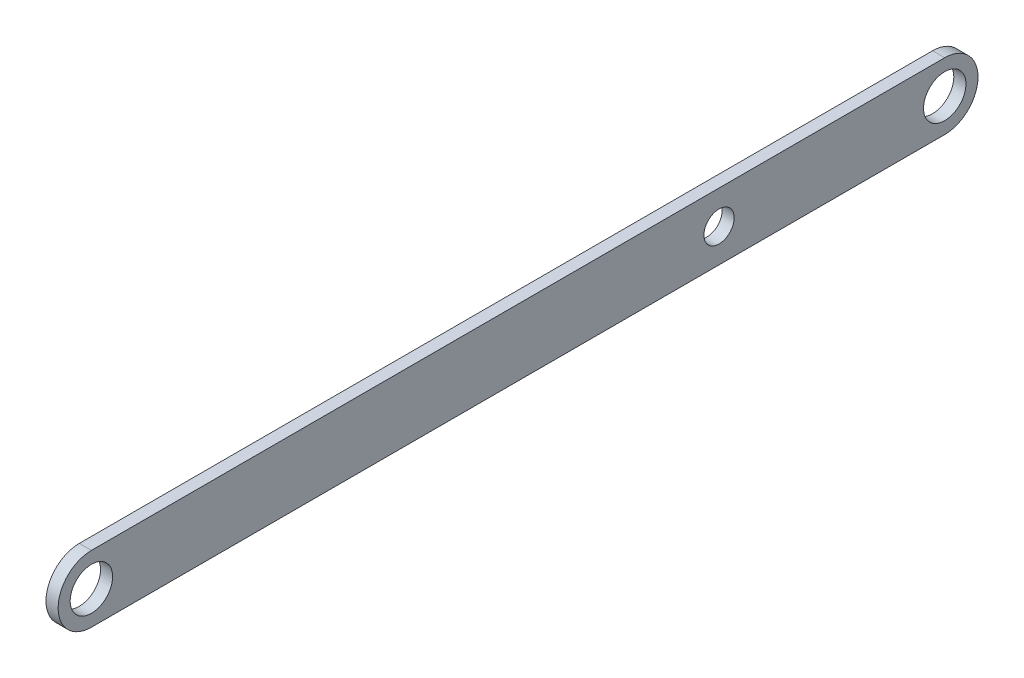
ISO-10303-21;
HEADER;
FILE_DESCRIPTION(('STEP AP214'),'2;1');
FILE_NAME('part.step','',(''),(''),'','','');
FILE_SCHEMA(('AUTOMOTIVE_DESIGN { 1 0 10303 214 1 1 1 1 }'));
ENDSEC;
DATA;
#1=APPLICATION_CONTEXT('core data for automotive mechanical design processes');
#2=APPLICATION_PROTOCOL_DEFINITION('international standard','automotive_design',2000,#1);
#3=PRODUCT_CONTEXT('',#1,'mechanical');
#4=PRODUCT('Part','Part','',(#3));
#5=PRODUCT_RELATED_PRODUCT_CATEGORY('part','',(#4));
#6=PRODUCT_DEFINITION_FORMATION('','',#4);
#7=PRODUCT_DEFINITION_CONTEXT('part definition',#1,'design');
#8=PRODUCT_DEFINITION('design','',#6,#7);
#9=PRODUCT_DEFINITION_SHAPE('','',#8);
#10=(LENGTH_UNIT() NAMED_UNIT(*) SI_UNIT(.MILLI.,.METRE.));
#11=(NAMED_UNIT(*) PLANE_ANGLE_UNIT() SI_UNIT($,.RADIAN.));
#12=(NAMED_UNIT(*) SI_UNIT($,.STERADIAN.) SOLID_ANGLE_UNIT());
#13=UNCERTAINTY_MEASURE_WITH_UNIT(LENGTH_MEASURE(1.E-05),#10,'distance_accuracy_value','');
#14=(GEOMETRIC_REPRESENTATION_CONTEXT(3) GLOBAL_UNCERTAINTY_ASSIGNED_CONTEXT((#13)) GLOBAL_UNIT_ASSIGNED_CONTEXT((#10,
#11,#12)) REPRESENTATION_CONTEXT('',''));
#15=CARTESIAN_POINT('',(0.,0.,0.));
#16=DIRECTION('',(0.,0.,1.));
#17=DIRECTION('',(1.,0.,0.));
#18=AXIS2_PLACEMENT_3D('',#15,#16,#17);
#19=CARTESIAN_POINT('',(4.,0.,77.5394838913124));
#20=DIRECTION('',(1.,0.,0.));
#21=DIRECTION('',(0.,0.,-1.));
#22=AXIS2_PLACEMENT_3D('',#19,#20,#21);
#23=PLANE('',#22);
#24=CARTESIAN_POINT('',(4.,0.,-204.077859883324));
#25=DIRECTION('',(1.,0.,0.));
#26=DIRECTION('',(0.,0.,-1.));
#27=AXIS2_PLACEMENT_3D('',#24,#25,#26);
#28=CIRCLE('',#27,7.00000000000001);
#29=CARTESIAN_POINT('',(4.,0.,-211.077859883324));
#30=VERTEX_POINT('',#29);
#31=EDGE_CURVE('E135',#30,#30,#28,.T.);
#32=ORIENTED_EDGE('',*,*,#31,.F.);
#33=EDGE_LOOP('',(#32));
#34=FACE_BOUND('',#33,.T.);
#35=CARTESIAN_POINT('',(4.,0.,77.5394838913124));
#36=DIRECTION('',(1.,0.,0.));
#37=DIRECTION('',(0.,0.,-1.));
#38=AXIS2_PLACEMENT_3D('',#35,#36,#37);
#39=CIRCLE('',#38,10.9868649813423);
#40=CARTESIAN_POINT('',(4.,10.9868649813423,77.5394838913124));
#41=VERTEX_POINT('',#40);
#42=CARTESIAN_POINT('',(4.,-10.9868649813423,77.5394838913124));
#43=VERTEX_POINT('',#42);
#44=EDGE_CURVE('E96',#41,#43,#39,.T.);
#45=ORIENTED_EDGE('',*,*,#44,.T.);
#46=DIRECTION('',(0.,0.,-1.));
#47=VECTOR('',#46,1.);
#48=CARTESIAN_POINT('',(4.,-10.9868649813423,77.5394838913124));
#49=LINE('',#48,#47);
#50=CARTESIAN_POINT('',(4.,-10.9868649813423,-204.077859883324));
#51=VERTEX_POINT('',#50);
#52=EDGE_CURVE('E91',#43,#51,#49,.T.);
#53=ORIENTED_EDGE('',*,*,#52,.T.);
#54=CARTESIAN_POINT('',(4.,0.,-204.077859883324));
#55=DIRECTION('',(1.,0.,0.));
#56=DIRECTION('',(0.,0.,-1.));
#57=AXIS2_PLACEMENT_3D('',#54,#55,#56);
#58=CIRCLE('',#57,10.9868649813423);
#59=CARTESIAN_POINT('',(4.,10.9868649813423,-204.077859883324));
#60=VERTEX_POINT('',#59);
#61=EDGE_CURVE('E94',#51,#60,#58,.T.);
#62=ORIENTED_EDGE('',*,*,#61,.T.);
#63=DIRECTION('',(0.,0.,1.));
#64=VECTOR('',#63,1.);
#65=CARTESIAN_POINT('',(4.,10.9868649813423,77.5394838913124));
#66=LINE('',#65,#64);
#67=EDGE_CURVE('E60',#60,#41,#66,.T.);
#68=ORIENTED_EDGE('',*,*,#67,.T.);
#69=EDGE_LOOP('',(#45,#53,#62,#68));
#70=FACE_BOUND('',#69,.T.);
#71=CARTESIAN_POINT('',(4.,0.,77.5394838913124));
#72=DIRECTION('',(1.,0.,0.));
#73=DIRECTION('',(0.,0.,-1.));
#74=AXIS2_PLACEMENT_3D('',#71,#72,#73);
#75=CIRCLE('',#74,7.);
#76=CARTESIAN_POINT('',(4.,0.,70.5394838913124));
#77=VERTEX_POINT('',#76);
#78=EDGE_CURVE('E114',#77,#77,#75,.T.);
#79=ORIENTED_EDGE('',*,*,#78,.F.);
#80=EDGE_LOOP('',(#79));
#81=FACE_BOUND('',#80,.T.);
#82=CARTESIAN_POINT('',(4.,0.,-129.598441876233));
#83=DIRECTION('',(1.,0.,0.));
#84=DIRECTION('',(0.,0.,-1.));
#85=AXIS2_PLACEMENT_3D('',#82,#83,#84);
#86=CIRCLE('',#85,4.99999999999999);
#87=CARTESIAN_POINT('',(4.,0.,-134.598441876233));
#88=VERTEX_POINT('',#87);
#89=EDGE_CURVE('E142',#88,#88,#86,.T.);
#90=ORIENTED_EDGE('',*,*,#89,.F.);
#91=EDGE_LOOP('',(#90));
#92=FACE_BOUND('',#91,.T.);
#93=ADVANCED_FACE('F39',(#34,#70,#81,#92),#23,.T.);
#94=CARTESIAN_POINT('',(0.,0.,77.5394838913124));
#95=DIRECTION('',(1.,0.,0.));
#96=DIRECTION('',(0.,0.,-1.));
#97=AXIS2_PLACEMENT_3D('',#94,#95,#96);
#98=PLANE('',#97);
#99=CARTESIAN_POINT('',(0.,0.,77.5394838913124));
#100=DIRECTION('',(1.,0.,0.));
#101=DIRECTION('',(0.,0.,-1.));
#102=AXIS2_PLACEMENT_3D('',#99,#100,#101);
#103=CIRCLE('',#102,10.9868649813423);
#104=CARTESIAN_POINT('',(0.,10.9868649813423,77.5394838913124));
#105=VERTEX_POINT('',#104);
#106=CARTESIAN_POINT('',(0.,-10.9868649813423,77.5394838913124));
#107=VERTEX_POINT('',#106);
#108=EDGE_CURVE('E110',#105,#107,#103,.T.);
#109=ORIENTED_EDGE('',*,*,#108,.F.);
#110=DIRECTION('',(0.,0.,1.));
#111=VECTOR('',#110,1.);
#112=CARTESIAN_POINT('',(0.,10.9868649813423,77.5394838913124));
#113=LINE('',#112,#111);
#114=CARTESIAN_POINT('',(0.,10.9868649813423,-204.077859883324));
#115=VERTEX_POINT('',#114);
#116=EDGE_CURVE('E83',#115,#105,#113,.T.);
#117=ORIENTED_EDGE('',*,*,#116,.F.);
#118=CARTESIAN_POINT('',(0.,0.,-204.077859883324));
#119=DIRECTION('',(1.,0.,0.));
#120=DIRECTION('',(0.,0.,-1.));
#121=AXIS2_PLACEMENT_3D('',#118,#119,#120);
#122=CIRCLE('',#121,10.9868649813423);
#123=CARTESIAN_POINT('',(0.,-10.9868649813423,-204.077859883324));
#124=VERTEX_POINT('',#123);
#125=EDGE_CURVE('E77',#124,#115,#122,.T.);
#126=ORIENTED_EDGE('',*,*,#125,.F.);
#127=DIRECTION('',(0.,0.,-1.));
#128=VECTOR('',#127,1.);
#129=CARTESIAN_POINT('',(0.,-10.9868649813423,77.5394838913124));
#130=LINE('',#129,#128);
#131=EDGE_CURVE('E101',#107,#124,#130,.T.);
#132=ORIENTED_EDGE('',*,*,#131,.F.);
#133=EDGE_LOOP('',(#109,#117,#126,#132));
#134=FACE_BOUND('',#133,.T.);
#135=CARTESIAN_POINT('',(0.,0.,77.5394838913124));
#136=DIRECTION('',(1.,0.,0.));
#137=DIRECTION('',(0.,0.,-1.));
#138=AXIS2_PLACEMENT_3D('',#135,#136,#137);
#139=CIRCLE('',#138,7.);
#140=CARTESIAN_POINT('',(0.,0.,70.5394838913124));
#141=VERTEX_POINT('',#140);
#142=EDGE_CURVE('E131',#141,#141,#139,.T.);
#143=ORIENTED_EDGE('',*,*,#142,.T.);
#144=EDGE_LOOP('',(#143));
#145=FACE_BOUND('',#144,.T.);
#146=CARTESIAN_POINT('',(0.,0.,-204.077859883324));
#147=DIRECTION('',(1.,0.,0.));
#148=DIRECTION('',(0.,0.,-1.));
#149=AXIS2_PLACEMENT_3D('',#146,#147,#148);
#150=CIRCLE('',#149,7.00000000000001);
#151=CARTESIAN_POINT('',(0.,0.,-211.077859883324));
#152=VERTEX_POINT('',#151);
#153=EDGE_CURVE('E139',#152,#152,#150,.T.);
#154=ORIENTED_EDGE('',*,*,#153,.T.);
#155=EDGE_LOOP('',(#154));
#156=FACE_BOUND('',#155,.T.);
#157=CARTESIAN_POINT('',(0.,0.,-129.598441876233));
#158=DIRECTION('',(1.,0.,0.));
#159=DIRECTION('',(0.,0.,-1.));
#160=AXIS2_PLACEMENT_3D('',#157,#158,#159);
#161=CIRCLE('',#160,4.99999999999999);
#162=CARTESIAN_POINT('',(0.,0.,-134.598441876233));
#163=VERTEX_POINT('',#162);
#164=EDGE_CURVE('E145',#163,#163,#161,.T.);
#165=ORIENTED_EDGE('',*,*,#164,.T.);
#166=EDGE_LOOP('',(#165));
#167=FACE_BOUND('',#166,.T.);
#168=ADVANCED_FACE('F125',(#134,#145,#156,#167),#98,.F.);
#169=CARTESIAN_POINT('',(4.,0.,77.5394838913124));
#170=DIRECTION('',(-1.,0.,0.));
#171=DIRECTION('',(0.,0.,1.));
#172=AXIS2_PLACEMENT_3D('',#169,#170,#171);
#173=CYLINDRICAL_SURFACE('',#172,10.9868649813423);
#174=ORIENTED_EDGE('',*,*,#108,.T.);
#175=DIRECTION('',(-1.,0.,0.));
#176=VECTOR('',#175,1.);
#177=CARTESIAN_POINT('',(4.,-10.9868649813423,77.5394838913124));
#178=LINE('',#177,#176);
#179=EDGE_CURVE('E11',#43,#107,#178,.T.);
#180=ORIENTED_EDGE('',*,*,#179,.F.);
#181=ORIENTED_EDGE('',*,*,#44,.F.);
#182=DIRECTION('',(-1.,0.,0.));
#183=VECTOR('',#182,1.);
#184=CARTESIAN_POINT('',(4.,10.9868649813423,77.5394838913124));
#185=LINE('',#184,#183);
#186=EDGE_CURVE('E106',#41,#105,#185,.T.);
#187=ORIENTED_EDGE('',*,*,#186,.T.);
#188=EDGE_LOOP('',(#174,#180,#181,#187));
#189=FACE_BOUND('',#188,.T.);
#190=ADVANCED_FACE('F41',(#189),#173,.T.);
#191=CARTESIAN_POINT('',(4.,-10.9868649813423,77.5394838913124));
#192=DIRECTION('',(0.,1.,0.));
#193=DIRECTION('',(0.,0.,1.));
#194=AXIS2_PLACEMENT_3D('',#191,#192,#193);
#195=PLANE('',#194);
#196=ORIENTED_EDGE('',*,*,#131,.T.);
#197=DIRECTION('',(-1.,0.,0.));
#198=VECTOR('',#197,1.);
#199=CARTESIAN_POINT('',(4.,-10.9868649813423,-204.077859883324));
#200=LINE('',#199,#198);
#201=EDGE_CURVE('E49',#51,#124,#200,.T.);
#202=ORIENTED_EDGE('',*,*,#201,.F.);
#203=ORIENTED_EDGE('',*,*,#52,.F.);
#204=ORIENTED_EDGE('',*,*,#179,.T.);
#205=EDGE_LOOP('',(#196,#202,#203,#204));
#206=FACE_BOUND('',#205,.T.);
#207=ADVANCED_FACE('F100',(#206),#195,.F.);
#208=CARTESIAN_POINT('',(4.,0.,-204.077859883324));
#209=DIRECTION('',(-1.,0.,0.));
#210=DIRECTION('',(0.,0.,1.));
#211=AXIS2_PLACEMENT_3D('',#208,#209,#210);
#212=CYLINDRICAL_SURFACE('',#211,10.9868649813423);
#213=ORIENTED_EDGE('',*,*,#125,.T.);
#214=DIRECTION('',(-1.,0.,0.));
#215=VECTOR('',#214,1.);
#216=CARTESIAN_POINT('',(4.,10.9868649813423,-204.077859883324));
#217=LINE('',#216,#215);
#218=EDGE_CURVE('E102',#60,#115,#217,.T.);
#219=ORIENTED_EDGE('',*,*,#218,.F.);
#220=ORIENTED_EDGE('',*,*,#61,.F.);
#221=ORIENTED_EDGE('',*,*,#201,.T.);
#222=EDGE_LOOP('',(#213,#219,#220,#221));
#223=FACE_BOUND('',#222,.T.);
#224=ADVANCED_FACE('F103',(#223),#212,.T.);
#225=CARTESIAN_POINT('',(4.,10.9868649813423,77.5394838913124));
#226=DIRECTION('',(0.,-1.,0.));
#227=DIRECTION('',(0.,0.,-1.));
#228=AXIS2_PLACEMENT_3D('',#225,#226,#227);
#229=PLANE('',#228);
#230=ORIENTED_EDGE('',*,*,#116,.T.);
#231=ORIENTED_EDGE('',*,*,#186,.F.);
#232=ORIENTED_EDGE('',*,*,#67,.F.);
#233=ORIENTED_EDGE('',*,*,#218,.T.);
#234=EDGE_LOOP('',(#230,#231,#232,#233));
#235=FACE_BOUND('',#234,.T.);
#236=ADVANCED_FACE('F122',(#235),#229,.F.);
#237=CARTESIAN_POINT('',(4.,0.,77.5394838913124));
#238=DIRECTION('',(-1.,0.,0.));
#239=DIRECTION('',(0.,0.,1.));
#240=AXIS2_PLACEMENT_3D('',#237,#238,#239);
#241=CYLINDRICAL_SURFACE('',#240,7.);
#242=ORIENTED_EDGE('',*,*,#78,.T.);
#243=EDGE_LOOP('',(#242));
#244=FACE_BOUND('',#243,.T.);
#245=ORIENTED_EDGE('',*,*,#142,.F.);
#246=EDGE_LOOP('',(#245));
#247=FACE_BOUND('',#246,.T.);
#248=ADVANCED_FACE('F164',(#244,#247),#241,.F.);
#249=CARTESIAN_POINT('',(4.,0.,-204.077859883324));
#250=DIRECTION('',(-1.,0.,0.));
#251=DIRECTION('',(0.,0.,1.));
#252=AXIS2_PLACEMENT_3D('',#249,#250,#251);
#253=CYLINDRICAL_SURFACE('',#252,7.00000000000001);
#254=ORIENTED_EDGE('',*,*,#31,.T.);
#255=EDGE_LOOP('',(#254));
#256=FACE_BOUND('',#255,.T.);
#257=ORIENTED_EDGE('',*,*,#153,.F.);
#258=EDGE_LOOP('',(#257));
#259=FACE_BOUND('',#258,.T.);
#260=ADVANCED_FACE('F198',(#256,#259),#253,.F.);
#261=CARTESIAN_POINT('',(4.,0.,-129.598441876233));
#262=DIRECTION('',(-1.,0.,0.));
#263=DIRECTION('',(0.,0.,1.));
#264=AXIS2_PLACEMENT_3D('',#261,#262,#263);
#265=CYLINDRICAL_SURFACE('',#264,4.99999999999999);
#266=ORIENTED_EDGE('',*,*,#89,.T.);
#267=EDGE_LOOP('',(#266));
#268=FACE_BOUND('',#267,.T.);
#269=ORIENTED_EDGE('',*,*,#164,.F.);
#270=EDGE_LOOP('',(#269));
#271=FACE_BOUND('',#270,.T.);
#272=ADVANCED_FACE('F152',(#268,#271),#265,.F.);
#273=CLOSED_SHELL('',(#93,#168,#190,#207,#224,#236,#248,#260,#272));
#274=MANIFOLD_SOLID_BREP('B2',#273);
#275=ADVANCED_BREP_SHAPE_REPRESENTATION('',(#18,#274),#14);
#276=SHAPE_DEFINITION_REPRESENTATION(#9,#275);
ENDSEC;
END-ISO-10303-21;
